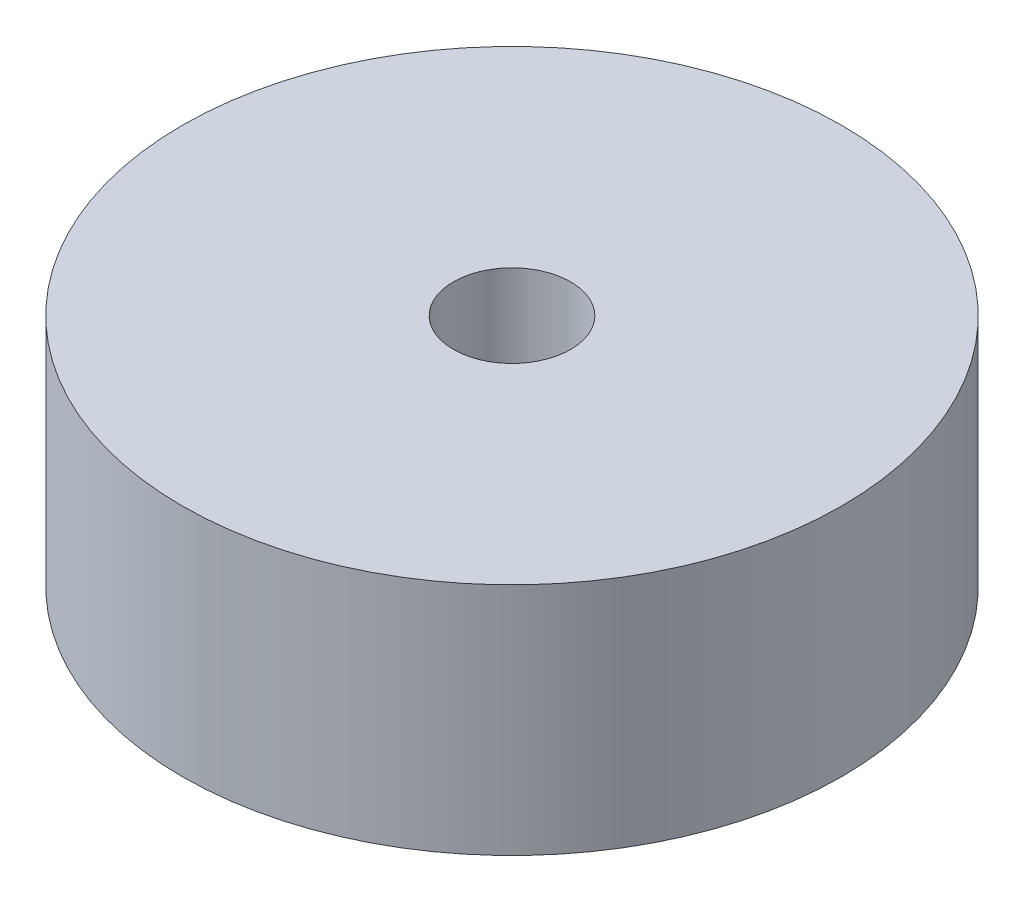
ISO-10303-21;
HEADER;
FILE_DESCRIPTION(('STEP AP214'),'2;1');
FILE_NAME('part.step','',(''),(''),'','','');
FILE_SCHEMA(('AUTOMOTIVE_DESIGN { 1 0 10303 214 1 1 1 1 }'));
ENDSEC;
DATA;
#1=APPLICATION_CONTEXT('core data for automotive mechanical design processes');
#2=APPLICATION_PROTOCOL_DEFINITION('international standard','automotive_design',2000,#1);
#3=PRODUCT_CONTEXT('',#1,'mechanical');
#4=PRODUCT('Part','Part','',(#3));
#5=PRODUCT_RELATED_PRODUCT_CATEGORY('part','',(#4));
#6=PRODUCT_DEFINITION_FORMATION('','',#4);
#7=PRODUCT_DEFINITION_CONTEXT('part definition',#1,'design');
#8=PRODUCT_DEFINITION('design','',#6,#7);
#9=PRODUCT_DEFINITION_SHAPE('','',#8);
#10=(LENGTH_UNIT() NAMED_UNIT(*) SI_UNIT(.MILLI.,.METRE.));
#11=(NAMED_UNIT(*) PLANE_ANGLE_UNIT() SI_UNIT($,.RADIAN.));
#12=(NAMED_UNIT(*) SI_UNIT($,.STERADIAN.) SOLID_ANGLE_UNIT());
#13=UNCERTAINTY_MEASURE_WITH_UNIT(LENGTH_MEASURE(1.E-05),#10,'distance_accuracy_value','');
#14=(GEOMETRIC_REPRESENTATION_CONTEXT(3) GLOBAL_UNCERTAINTY_ASSIGNED_CONTEXT((#13)) GLOBAL_UNIT_ASSIGNED_CONTEXT((#10,
#11,#12)) REPRESENTATION_CONTEXT('',''));
#15=CARTESIAN_POINT('',(0.,0.,0.));
#16=DIRECTION('',(0.,0.,1.));
#17=DIRECTION('',(1.,0.,0.));
#18=AXIS2_PLACEMENT_3D('',#15,#16,#17);
#19=CARTESIAN_POINT('',(0.,16.,0.));
#20=DIRECTION('',(0.,1.,0.));
#21=DIRECTION('',(0.,0.,1.));
#22=AXIS2_PLACEMENT_3D('',#19,#20,#21);
#23=PLANE('',#22);
#24=CARTESIAN_POINT('',(0.,16.,0.));
#25=DIRECTION('',(0.,1.,0.));
#26=DIRECTION('',(0.,0.,1.));
#27=AXIS2_PLACEMENT_3D('',#24,#25,#26);
#28=CIRCLE('',#27,22.5);
#29=CARTESIAN_POINT('',(0.,16.,22.5));
#30=VERTEX_POINT('',#29);
#31=EDGE_CURVE('E10',#30,#30,#28,.T.);
#32=ORIENTED_EDGE('',*,*,#31,.T.);
#33=EDGE_LOOP('',(#32));
#34=FACE_BOUND('',#33,.T.);
#35=CARTESIAN_POINT('',(0.,16.,0.));
#36=DIRECTION('',(0.,1.,0.));
#37=DIRECTION('',(0.,0.,1.));
#38=AXIS2_PLACEMENT_3D('',#35,#36,#37);
#39=CIRCLE('',#38,4.);
#40=CARTESIAN_POINT('',(0.,16.,4.));
#41=VERTEX_POINT('',#40);
#42=EDGE_CURVE('E57',#41,#41,#39,.T.);
#43=ORIENTED_EDGE('',*,*,#42,.F.);
#44=EDGE_LOOP('',(#43));
#45=FACE_BOUND('',#44,.T.);
#46=ADVANCED_FACE('F43',(#34,#45),#23,.T.);
#47=CARTESIAN_POINT('',(0.,0.,0.));
#48=DIRECTION('',(0.,1.,0.));
#49=DIRECTION('',(0.,0.,1.));
#50=AXIS2_PLACEMENT_3D('',#47,#48,#49);
#51=PLANE('',#50);
#52=CARTESIAN_POINT('',(0.,0.,0.));
#53=DIRECTION('',(0.,1.,0.));
#54=DIRECTION('',(0.,0.,1.));
#55=AXIS2_PLACEMENT_3D('',#52,#53,#54);
#56=CIRCLE('',#55,22.5);
#57=CARTESIAN_POINT('',(0.,0.,22.5));
#58=VERTEX_POINT('',#57);
#59=EDGE_CURVE('E50',#58,#58,#56,.T.);
#60=ORIENTED_EDGE('',*,*,#59,.F.);
#61=EDGE_LOOP('',(#60));
#62=FACE_BOUND('',#61,.T.);
#63=CARTESIAN_POINT('',(0.,0.,0.));
#64=DIRECTION('',(0.,1.,0.));
#65=DIRECTION('',(0.,0.,1.));
#66=AXIS2_PLACEMENT_3D('',#63,#64,#65);
#67=CIRCLE('',#66,4.);
#68=CARTESIAN_POINT('',(0.,0.,4.));
#69=VERTEX_POINT('',#68);
#70=EDGE_CURVE('E59',#69,#69,#67,.T.);
#71=ORIENTED_EDGE('',*,*,#70,.T.);
#72=EDGE_LOOP('',(#71));
#73=FACE_BOUND('',#72,.T.);
#74=ADVANCED_FACE('F68',(#62,#73),#51,.F.);
#75=CARTESIAN_POINT('',(0.,16.,0.));
#76=DIRECTION('',(0.,-1.,0.));
#77=DIRECTION('',(0.,0.,-1.));
#78=AXIS2_PLACEMENT_3D('',#75,#76,#77);
#79=CYLINDRICAL_SURFACE('',#78,22.5);
#80=ORIENTED_EDGE('',*,*,#31,.F.);
#81=EDGE_LOOP('',(#80));
#82=FACE_BOUND('',#81,.T.);
#83=ORIENTED_EDGE('',*,*,#59,.T.);
#84=EDGE_LOOP('',(#83));
#85=FACE_BOUND('',#84,.T.);
#86=ADVANCED_FACE('F44',(#82,#85),#79,.T.);
#87=CARTESIAN_POINT('',(0.,16.,0.));
#88=DIRECTION('',(0.,-1.,0.));
#89=DIRECTION('',(0.,0.,-1.));
#90=AXIS2_PLACEMENT_3D('',#87,#88,#89);
#91=CYLINDRICAL_SURFACE('',#90,4.);
#92=ORIENTED_EDGE('',*,*,#42,.T.);
#93=EDGE_LOOP('',(#92));
#94=FACE_BOUND('',#93,.T.);
#95=ORIENTED_EDGE('',*,*,#70,.F.);
#96=EDGE_LOOP('',(#95));
#97=FACE_BOUND('',#96,.T.);
#98=ADVANCED_FACE('F67',(#94,#97),#91,.F.);
#99=CLOSED_SHELL('',(#46,#74,#86,#98));
#100=MANIFOLD_SOLID_BREP('B2',#99);
#101=ADVANCED_BREP_SHAPE_REPRESENTATION('',(#18,#100),#14);
#102=SHAPE_DEFINITION_REPRESENTATION(#9,#101);
ENDSEC;
END-ISO-10303-21;
